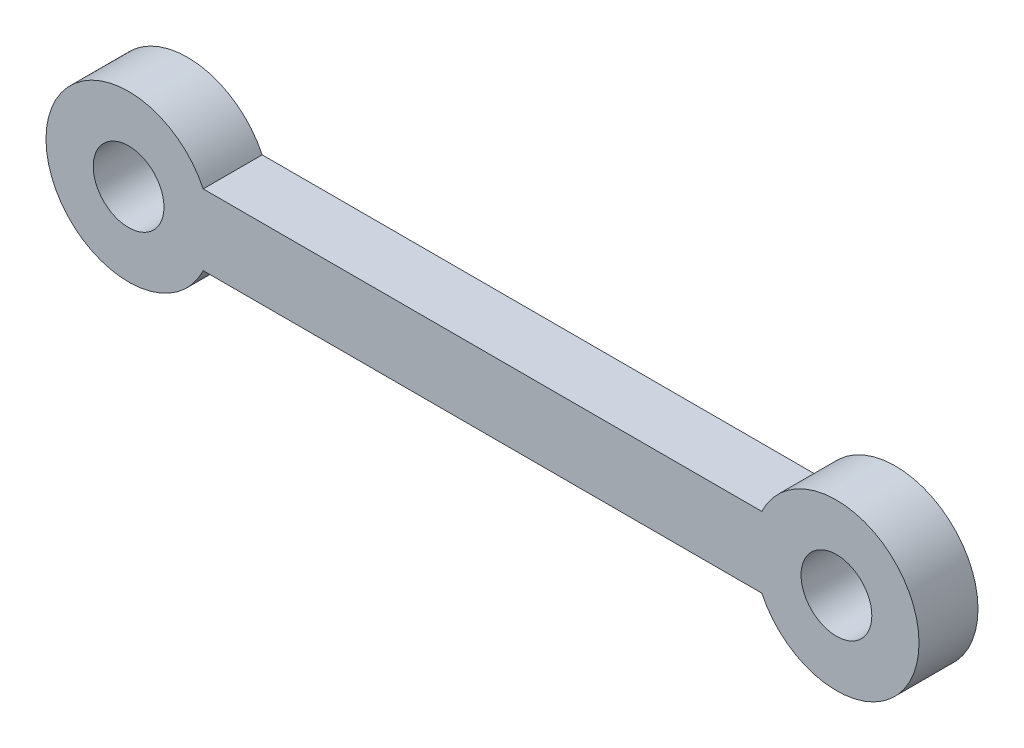
ISO-10303-21;
HEADER;
FILE_DESCRIPTION(('STEP AP214'),'2;1');
FILE_NAME('part.step','',(''),(''),'','','');
FILE_SCHEMA(('AUTOMOTIVE_DESIGN { 1 0 10303 214 1 1 1 1 }'));
ENDSEC;
DATA;
#1=APPLICATION_CONTEXT('core data for automotive mechanical design processes');
#2=APPLICATION_PROTOCOL_DEFINITION('international standard','automotive_design',2000,#1);
#3=PRODUCT_CONTEXT('',#1,'mechanical');
#4=PRODUCT('Part','Part','',(#3));
#5=PRODUCT_RELATED_PRODUCT_CATEGORY('part','',(#4));
#6=PRODUCT_DEFINITION_FORMATION('','',#4);
#7=PRODUCT_DEFINITION_CONTEXT('part definition',#1,'design');
#8=PRODUCT_DEFINITION('design','',#6,#7);
#9=PRODUCT_DEFINITION_SHAPE('','',#8);
#10=(LENGTH_UNIT() NAMED_UNIT(*) SI_UNIT(.MILLI.,.METRE.));
#11=(NAMED_UNIT(*) PLANE_ANGLE_UNIT() SI_UNIT($,.RADIAN.));
#12=(NAMED_UNIT(*) SI_UNIT($,.STERADIAN.) SOLID_ANGLE_UNIT());
#13=UNCERTAINTY_MEASURE_WITH_UNIT(LENGTH_MEASURE(1.E-05),#10,'distance_accuracy_value','');
#14=(GEOMETRIC_REPRESENTATION_CONTEXT(3) GLOBAL_UNCERTAINTY_ASSIGNED_CONTEXT((#13)) GLOBAL_UNIT_ASSIGNED_CONTEXT((#10,
#11,#12)) REPRESENTATION_CONTEXT('',''));
#15=CARTESIAN_POINT('',(0.,0.,0.));
#16=DIRECTION('',(0.,0.,1.));
#17=DIRECTION('',(1.,0.,0.));
#18=AXIS2_PLACEMENT_3D('',#15,#16,#17);
#19=CARTESIAN_POINT('',(-15.,0.,2.5));
#20=DIRECTION('',(0.,0.,1.));
#21=DIRECTION('',(1.,0.,0.));
#22=AXIS2_PLACEMENT_3D('',#19,#20,#21);
#23=PLANE('',#22);
#24=CARTESIAN_POINT('',(-15.,0.,2.5));
#25=DIRECTION('',(0.,0.,1.));
#26=DIRECTION('',(1.,0.,0.));
#27=AXIS2_PLACEMENT_3D('',#24,#25,#26);
#28=CIRCLE('',#27,1.5);
#29=CARTESIAN_POINT('',(-13.5,0.,2.5));
#30=VERTEX_POINT('',#29);
#31=EDGE_CURVE('E105',#30,#30,#28,.T.);
#32=ORIENTED_EDGE('',*,*,#31,.F.);
#33=EDGE_LOOP('',(#32));
#34=FACE_BOUND('',#33,.T.);
#35=CARTESIAN_POINT('',(-15.,0.,2.5));
#36=DIRECTION('',(0.,0.,1.));
#37=DIRECTION('',(1.,0.,0.));
#38=AXIS2_PLACEMENT_3D('',#35,#36,#37);
#39=CIRCLE('',#38,3.5);
#40=CARTESIAN_POINT('',(-11.8377223398316,1.5,2.5));
#41=VERTEX_POINT('',#40);
#42=CARTESIAN_POINT('',(-11.8377223398316,-1.5,2.5));
#43=VERTEX_POINT('',#42);
#44=EDGE_CURVE('E90',#41,#43,#39,.T.);
#45=ORIENTED_EDGE('',*,*,#44,.T.);
#46=DIRECTION('',(1.,0.,0.));
#47=VECTOR('',#46,1.);
#48=CARTESIAN_POINT('',(-11.8377223398316,-1.5,2.5));
#49=LINE('',#48,#47);
#50=CARTESIAN_POINT('',(11.8377223398316,-1.5,2.5));
#51=VERTEX_POINT('',#50);
#52=EDGE_CURVE('E85',#43,#51,#49,.T.);
#53=ORIENTED_EDGE('',*,*,#52,.T.);
#54=CARTESIAN_POINT('',(15.,0.,2.5));
#55=DIRECTION('',(0.,0.,1.));
#56=DIRECTION('',(1.,0.,0.));
#57=AXIS2_PLACEMENT_3D('',#54,#55,#56);
#58=CIRCLE('',#57,3.5);
#59=CARTESIAN_POINT('',(11.8377223398316,1.5,2.5));
#60=VERTEX_POINT('',#59);
#61=EDGE_CURVE('E88',#51,#60,#58,.T.);
#62=ORIENTED_EDGE('',*,*,#61,.T.);
#63=DIRECTION('',(-1.,0.,0.));
#64=VECTOR('',#63,1.);
#65=CARTESIAN_POINT('',(-11.8377223398316,1.5,2.5));
#66=LINE('',#65,#64);
#67=EDGE_CURVE('E55',#60,#41,#66,.T.);
#68=ORIENTED_EDGE('',*,*,#67,.T.);
#69=EDGE_LOOP('',(#45,#53,#62,#68));
#70=FACE_BOUND('',#69,.T.);
#71=CARTESIAN_POINT('',(15.,0.,2.5));
#72=DIRECTION('',(0.,0.,1.));
#73=DIRECTION('',(1.,0.,0.));
#74=AXIS2_PLACEMENT_3D('',#71,#72,#73);
#75=CIRCLE('',#74,1.5);
#76=CARTESIAN_POINT('',(16.5,0.,2.5));
#77=VERTEX_POINT('',#76);
#78=EDGE_CURVE('E120',#77,#77,#75,.T.);
#79=ORIENTED_EDGE('',*,*,#78,.F.);
#80=EDGE_LOOP('',(#79));
#81=FACE_BOUND('',#80,.T.);
#82=ADVANCED_FACE('F38',(#34,#70,#81),#23,.T.);
#83=CARTESIAN_POINT('',(-15.,0.,0.));
#84=DIRECTION('',(0.,0.,1.));
#85=DIRECTION('',(1.,0.,0.));
#86=AXIS2_PLACEMENT_3D('',#83,#84,#85);
#87=PLANE('',#86);
#88=CARTESIAN_POINT('',(-15.,0.,0.));
#89=DIRECTION('',(0.,0.,1.));
#90=DIRECTION('',(1.,0.,0.));
#91=AXIS2_PLACEMENT_3D('',#88,#89,#90);
#92=CIRCLE('',#91,3.5);
#93=CARTESIAN_POINT('',(-11.8377223398316,1.5,0.));
#94=VERTEX_POINT('',#93);
#95=CARTESIAN_POINT('',(-11.8377223398316,-1.5,0.));
#96=VERTEX_POINT('',#95);
#97=EDGE_CURVE('E102',#94,#96,#92,.T.);
#98=ORIENTED_EDGE('',*,*,#97,.F.);
#99=DIRECTION('',(-1.,0.,0.));
#100=VECTOR('',#99,1.);
#101=CARTESIAN_POINT('',(-11.8377223398316,1.5,0.));
#102=LINE('',#101,#100);
#103=CARTESIAN_POINT('',(11.8377223398316,1.5,0.));
#104=VERTEX_POINT('',#103);
#105=EDGE_CURVE('E78',#104,#94,#102,.T.);
#106=ORIENTED_EDGE('',*,*,#105,.F.);
#107=CARTESIAN_POINT('',(15.,0.,0.));
#108=DIRECTION('',(0.,0.,1.));
#109=DIRECTION('',(1.,0.,0.));
#110=AXIS2_PLACEMENT_3D('',#107,#108,#109);
#111=CIRCLE('',#110,3.5);
#112=CARTESIAN_POINT('',(11.8377223398316,-1.5,0.));
#113=VERTEX_POINT('',#112);
#114=EDGE_CURVE('E72',#113,#104,#111,.T.);
#115=ORIENTED_EDGE('',*,*,#114,.F.);
#116=DIRECTION('',(1.,0.,0.));
#117=VECTOR('',#116,1.);
#118=CARTESIAN_POINT('',(-11.8377223398316,-1.5,0.));
#119=LINE('',#118,#117);
#120=EDGE_CURVE('E94',#96,#113,#119,.T.);
#121=ORIENTED_EDGE('',*,*,#120,.F.);
#122=EDGE_LOOP('',(#98,#106,#115,#121));
#123=FACE_BOUND('',#122,.T.);
#124=CARTESIAN_POINT('',(-15.,0.,0.));
#125=DIRECTION('',(0.,0.,1.));
#126=DIRECTION('',(1.,0.,0.));
#127=AXIS2_PLACEMENT_3D('',#124,#125,#126);
#128=CIRCLE('',#127,1.5);
#129=CARTESIAN_POINT('',(-13.5,0.,0.));
#130=VERTEX_POINT('',#129);
#131=EDGE_CURVE('E117',#130,#130,#128,.T.);
#132=ORIENTED_EDGE('',*,*,#131,.T.);
#133=EDGE_LOOP('',(#132));
#134=FACE_BOUND('',#133,.T.);
#135=CARTESIAN_POINT('',(15.,0.,0.));
#136=DIRECTION('',(0.,0.,1.));
#137=DIRECTION('',(1.,0.,0.));
#138=AXIS2_PLACEMENT_3D('',#135,#136,#137);
#139=CIRCLE('',#138,1.5);
#140=CARTESIAN_POINT('',(16.5,0.,0.));
#141=VERTEX_POINT('',#140);
#142=EDGE_CURVE('E123',#141,#141,#139,.T.);
#143=ORIENTED_EDGE('',*,*,#142,.T.);
#144=EDGE_LOOP('',(#143));
#145=FACE_BOUND('',#144,.T.);
#146=ADVANCED_FACE('F113',(#123,#134,#145),#87,.F.);
#147=CARTESIAN_POINT('',(-15.,0.,2.5));
#148=DIRECTION('',(0.,0.,-1.));
#149=DIRECTION('',(-1.,0.,0.));
#150=AXIS2_PLACEMENT_3D('',#147,#148,#149);
#151=CYLINDRICAL_SURFACE('',#150,3.5);
#152=ORIENTED_EDGE('',*,*,#97,.T.);
#153=DIRECTION('',(0.,0.,-1.));
#154=VECTOR('',#153,1.);
#155=CARTESIAN_POINT('',(-11.8377223398316,-1.5,2.5));
#156=LINE('',#155,#154);
#157=EDGE_CURVE('E11',#43,#96,#156,.T.);
#158=ORIENTED_EDGE('',*,*,#157,.F.);
#159=ORIENTED_EDGE('',*,*,#44,.F.);
#160=DIRECTION('',(0.,0.,-1.));
#161=VECTOR('',#160,1.);
#162=CARTESIAN_POINT('',(-11.8377223398316,1.5,2.5));
#163=LINE('',#162,#161);
#164=EDGE_CURVE('E98',#41,#94,#163,.T.);
#165=ORIENTED_EDGE('',*,*,#164,.T.);
#166=EDGE_LOOP('',(#152,#158,#159,#165));
#167=FACE_BOUND('',#166,.T.);
#168=ADVANCED_FACE('F40',(#167),#151,.T.);
#169=CARTESIAN_POINT('',(-11.8377223398316,-1.5,2.5));
#170=DIRECTION('',(0.,1.,0.));
#171=DIRECTION('',(0.,0.,1.));
#172=AXIS2_PLACEMENT_3D('',#169,#170,#171);
#173=PLANE('',#172);
#174=ORIENTED_EDGE('',*,*,#120,.T.);
#175=DIRECTION('',(0.,0.,-1.));
#176=VECTOR('',#175,1.);
#177=CARTESIAN_POINT('',(11.8377223398316,-1.5,2.5));
#178=LINE('',#177,#176);
#179=EDGE_CURVE('E47',#51,#113,#178,.T.);
#180=ORIENTED_EDGE('',*,*,#179,.F.);
#181=ORIENTED_EDGE('',*,*,#52,.F.);
#182=ORIENTED_EDGE('',*,*,#157,.T.);
#183=EDGE_LOOP('',(#174,#180,#181,#182));
#184=FACE_BOUND('',#183,.T.);
#185=ADVANCED_FACE('F93',(#184),#173,.F.);
#186=CARTESIAN_POINT('',(15.,0.,2.5));
#187=DIRECTION('',(0.,0.,-1.));
#188=DIRECTION('',(-1.,0.,0.));
#189=AXIS2_PLACEMENT_3D('',#186,#187,#188);
#190=CYLINDRICAL_SURFACE('',#189,3.5);
#191=ORIENTED_EDGE('',*,*,#114,.T.);
#192=DIRECTION('',(0.,0.,-1.));
#193=VECTOR('',#192,1.);
#194=CARTESIAN_POINT('',(11.8377223398316,1.5,2.5));
#195=LINE('',#194,#193);
#196=EDGE_CURVE('E95',#60,#104,#195,.T.);
#197=ORIENTED_EDGE('',*,*,#196,.F.);
#198=ORIENTED_EDGE('',*,*,#61,.F.);
#199=ORIENTED_EDGE('',*,*,#179,.T.);
#200=EDGE_LOOP('',(#191,#197,#198,#199));
#201=FACE_BOUND('',#200,.T.);
#202=ADVANCED_FACE('F96',(#201),#190,.T.);
#203=CARTESIAN_POINT('',(-11.8377223398316,1.5,2.5));
#204=DIRECTION('',(0.,-1.,0.));
#205=DIRECTION('',(0.,0.,-1.));
#206=AXIS2_PLACEMENT_3D('',#203,#204,#205);
#207=PLANE('',#206);
#208=ORIENTED_EDGE('',*,*,#105,.T.);
#209=ORIENTED_EDGE('',*,*,#164,.F.);
#210=ORIENTED_EDGE('',*,*,#67,.F.);
#211=ORIENTED_EDGE('',*,*,#196,.T.);
#212=EDGE_LOOP('',(#208,#209,#210,#211));
#213=FACE_BOUND('',#212,.T.);
#214=ADVANCED_FACE('F110',(#213),#207,.F.);
#215=CARTESIAN_POINT('',(-15.,0.,2.5));
#216=DIRECTION('',(0.,0.,-1.));
#217=DIRECTION('',(-1.,0.,0.));
#218=AXIS2_PLACEMENT_3D('',#215,#216,#217);
#219=CYLINDRICAL_SURFACE('',#218,1.5);
#220=ORIENTED_EDGE('',*,*,#31,.T.);
#221=EDGE_LOOP('',(#220));
#222=FACE_BOUND('',#221,.T.);
#223=ORIENTED_EDGE('',*,*,#131,.F.);
#224=EDGE_LOOP('',(#223));
#225=FACE_BOUND('',#224,.T.);
#226=ADVANCED_FACE('F140',(#222,#225),#219,.F.);
#227=CARTESIAN_POINT('',(15.,0.,2.5));
#228=DIRECTION('',(0.,0.,-1.));
#229=DIRECTION('',(-1.,0.,0.));
#230=AXIS2_PLACEMENT_3D('',#227,#228,#229);
#231=CYLINDRICAL_SURFACE('',#230,1.5);
#232=ORIENTED_EDGE('',*,*,#78,.T.);
#233=EDGE_LOOP('',(#232));
#234=FACE_BOUND('',#233,.T.);
#235=ORIENTED_EDGE('',*,*,#142,.F.);
#236=EDGE_LOOP('',(#235));
#237=FACE_BOUND('',#236,.T.);
#238=ADVANCED_FACE('F129',(#234,#237),#231,.F.);
#239=CLOSED_SHELL('',(#82,#146,#168,#185,#202,#214,#226,#238));
#240=MANIFOLD_SOLID_BREP('B2',#239);
#241=ADVANCED_BREP_SHAPE_REPRESENTATION('',(#18,#240),#14);
#242=SHAPE_DEFINITION_REPRESENTATION(#9,#241);
ENDSEC;
END-ISO-10303-21;
